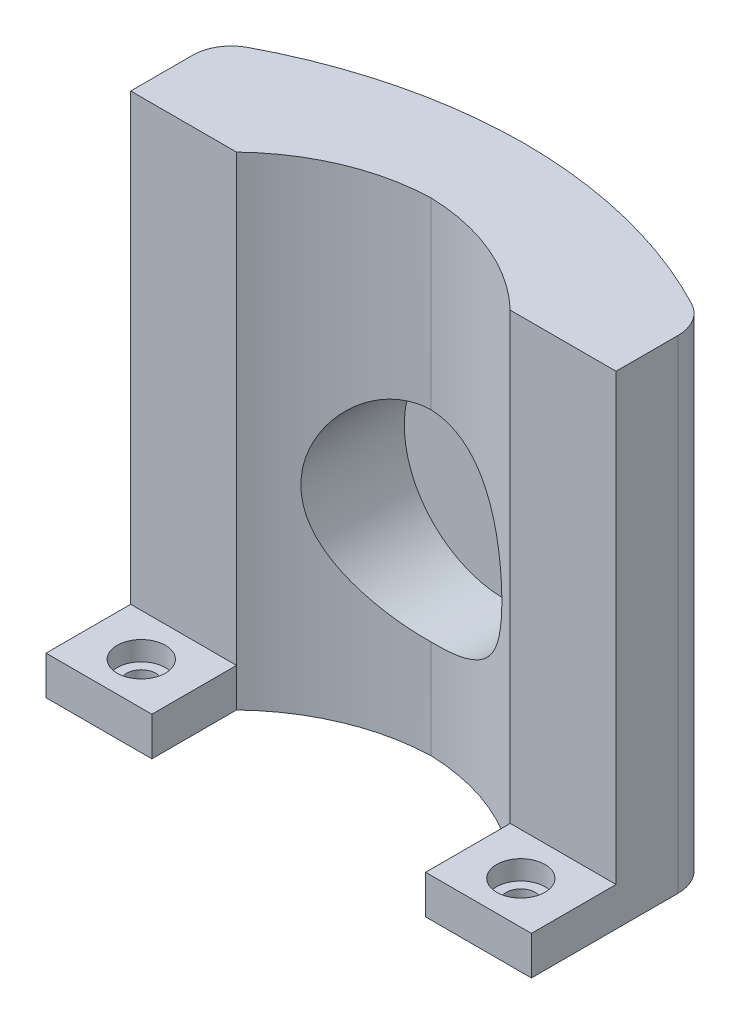
ISO-10303-21;
HEADER;
FILE_DESCRIPTION(('STEP AP214'),'2;1');
FILE_NAME('part.step','',(''),(''),'','','');
FILE_SCHEMA(('AUTOMOTIVE_DESIGN { 1 0 10303 214 1 1 1 1 }'));
ENDSEC;
DATA;
#1=APPLICATION_CONTEXT('core data for automotive mechanical design processes');
#2=APPLICATION_PROTOCOL_DEFINITION('international standard','automotive_design',2000,#1);
#3=PRODUCT_CONTEXT('',#1,'mechanical');
#4=PRODUCT('Part','Part','',(#3));
#5=PRODUCT_RELATED_PRODUCT_CATEGORY('part','',(#4));
#6=PRODUCT_DEFINITION_FORMATION('','',#4);
#7=PRODUCT_DEFINITION_CONTEXT('part definition',#1,'design');
#8=PRODUCT_DEFINITION('design','',#6,#7);
#9=PRODUCT_DEFINITION_SHAPE('','',#8);
#10=(LENGTH_UNIT() NAMED_UNIT(*) SI_UNIT(.MILLI.,.METRE.));
#11=(NAMED_UNIT(*) PLANE_ANGLE_UNIT() SI_UNIT($,.RADIAN.));
#12=(NAMED_UNIT(*) SI_UNIT($,.STERADIAN.) SOLID_ANGLE_UNIT());
#13=UNCERTAINTY_MEASURE_WITH_UNIT(LENGTH_MEASURE(1.E-05),#10,'distance_accuracy_value','');
#14=(GEOMETRIC_REPRESENTATION_CONTEXT(3) GLOBAL_UNCERTAINTY_ASSIGNED_CONTEXT((#13)) GLOBAL_UNIT_ASSIGNED_CONTEXT((#10,
#11,#12)) REPRESENTATION_CONTEXT('',''));
#15=CARTESIAN_POINT('',(0.,0.,0.));
#16=DIRECTION('',(0.,0.,1.));
#17=DIRECTION('',(1.,0.,0.));
#18=AXIS2_PLACEMENT_3D('',#15,#16,#17);
#19=CARTESIAN_POINT('',(-0.180505990510404,63.5,-0.311093454396658));
#20=DIRECTION('',(0.,-1.,0.));
#21=DIRECTION('',(0.,0.,-1.));
#22=AXIS2_PLACEMENT_3D('',#19,#20,#21);
#23=CYLINDRICAL_SURFACE('',#22,62.976967567455);
#24=CARTESIAN_POINT('',(-0.180505990510404,63.5,-0.311093454396658));
#25=DIRECTION('',(0.,1.,0.));
#26=DIRECTION('',(0.,0.,1.));
#27=AXIS2_PLACEMENT_3D('',#24,#25,#26);
#28=CIRCLE('',#27,62.976967567455);
#29=CARTESIAN_POINT('',(0.,63.5,-63.2878023361703));
#30=VERTEX_POINT('',#29);
#31=CARTESIAN_POINT('',(29.1850100160938,63.5,-56.022536746221));
#32=VERTEX_POINT('',#31);
#33=EDGE_CURVE('E255',#30,#32,#28,.F.);
#34=ORIENTED_EDGE('',*,*,#33,.T.);
#35=DIRECTION('',(0.,-1.,0.));
#36=VECTOR('',#35,1.);
#37=CARTESIAN_POINT('',(29.1850100160938,63.5,-56.022536746221));
#38=LINE('',#37,#36);
#39=CARTESIAN_POINT('',(29.1850100160938,0.,-56.022536746221));
#40=VERTEX_POINT('',#39);
#41=EDGE_CURVE('E154',#32,#40,#38,.T.);
#42=ORIENTED_EDGE('',*,*,#41,.T.);
#43=CARTESIAN_POINT('',(-0.180505990510404,0.,-0.311093454396658));
#44=DIRECTION('',(0.,1.,0.));
#45=DIRECTION('',(0.,0.,1.));
#46=AXIS2_PLACEMENT_3D('',#43,#44,#45);
#47=CIRCLE('',#46,62.976967567455);
#48=CARTESIAN_POINT('',(0.,0.,-63.2878023361703));
#49=VERTEX_POINT('',#48);
#50=EDGE_CURVE('E254',#49,#40,#47,.F.);
#51=ORIENTED_EDGE('',*,*,#50,.F.);
#52=DIRECTION('',(0.,-1.,0.));
#53=VECTOR('',#52,1.);
#54=CARTESIAN_POINT('',(0.,63.5,-63.2878023361703));
#55=LINE('',#54,#53);
#56=EDGE_CURVE('E155',#30,#49,#55,.T.);
#57=ORIENTED_EDGE('',*,*,#56,.F.);
#58=EDGE_LOOP('',(#34,#42,#51,#57));
#59=FACE_BOUND('',#58,.T.);
#60=ADVANCED_FACE('F35',(#59),#23,.T.);
#61=CARTESIAN_POINT('',(0.180505990510404,63.5,-0.311093454396602));
#62=DIRECTION('',(0.,-1.,0.));
#63=DIRECTION('',(0.,0.,-1.));
#64=AXIS2_PLACEMENT_3D('',#61,#62,#63);
#65=CYLINDRICAL_SURFACE('',#64,62.9769675674551);
#66=CARTESIAN_POINT('',(0.180505990510404,0.,-0.311093454396602));
#67=DIRECTION('',(0.,1.,0.));
#68=DIRECTION('',(0.,0.,1.));
#69=AXIS2_PLACEMENT_3D('',#66,#67,#68);
#70=CIRCLE('',#69,62.9769675674551);
#71=CARTESIAN_POINT('',(-29.1850100160938,0.,-56.022536746221));
#72=VERTEX_POINT('',#71);
#73=EDGE_CURVE('E258',#49,#72,#70,.T.);
#74=ORIENTED_EDGE('',*,*,#73,.T.);
#75=DIRECTION('',(0.,-1.,0.));
#76=VECTOR('',#75,1.);
#77=CARTESIAN_POINT('',(-29.1850100160938,63.5,-56.022536746221));
#78=LINE('',#77,#76);
#79=CARTESIAN_POINT('',(-29.1850100160938,63.5,-56.022536746221));
#80=VERTEX_POINT('',#79);
#81=EDGE_CURVE('E11',#72,#80,#78,.F.);
#82=ORIENTED_EDGE('',*,*,#81,.T.);
#83=CARTESIAN_POINT('',(0.180505990510404,63.5,-0.311093454396602));
#84=DIRECTION('',(0.,1.,0.));
#85=DIRECTION('',(0.,0.,1.));
#86=AXIS2_PLACEMENT_3D('',#83,#84,#85);
#87=CIRCLE('',#86,62.9769675674551);
#88=EDGE_CURVE('E296',#30,#80,#87,.T.);
#89=ORIENTED_EDGE('',*,*,#88,.F.);
#90=ORIENTED_EDGE('',*,*,#56,.T.);
#91=EDGE_LOOP('',(#74,#82,#89,#90));
#92=FACE_BOUND('',#91,.T.);
#93=ADVANCED_FACE('F218',(#92),#65,.T.);
#94=CARTESIAN_POINT('',(-31.8962579615627,63.5,0.));
#95=DIRECTION('',(1.,0.,0.));
#96=DIRECTION('',(0.,0.,-1.));
#97=AXIS2_PLACEMENT_3D('',#94,#95,#96);
#98=PLANE('',#97);
#99=DIRECTION('',(0.,0.,1.));
#100=VECTOR('',#99,1.);
#101=CARTESIAN_POINT('',(-31.8962579615627,63.5,0.));
#102=LINE('',#101,#100);
#103=CARTESIAN_POINT('',(-31.8962579615627,63.5,-51.5286059830522));
#104=VERTEX_POINT('',#103);
#105=CARTESIAN_POINT('',(-31.8962579615627,63.5,-43.3824232969375));
#106=VERTEX_POINT('',#105);
#107=EDGE_CURVE('E294',#104,#106,#102,.T.);
#108=ORIENTED_EDGE('',*,*,#107,.F.);
#109=DIRECTION('',(0.,-1.,0.));
#110=VECTOR('',#109,1.);
#111=CARTESIAN_POINT('',(-31.8962579615627,63.5,-51.5286059830522));
#112=LINE('',#111,#110);
#113=CARTESIAN_POINT('',(-31.8962579615627,0.,-51.5286059830522));
#114=VERTEX_POINT('',#113);
#115=EDGE_CURVE('E43',#104,#114,#112,.T.);
#116=ORIENTED_EDGE('',*,*,#115,.T.);
#117=DIRECTION('',(0.,0.,1.));
#118=VECTOR('',#117,1.);
#119=CARTESIAN_POINT('',(-31.8962579615627,0.,0.));
#120=LINE('',#119,#118);
#121=CARTESIAN_POINT('',(-31.8962579615627,0.,-32.258));
#122=VERTEX_POINT('',#121);
#123=EDGE_CURVE('E261',#114,#122,#120,.T.);
#124=ORIENTED_EDGE('',*,*,#123,.T.);
#125=DIRECTION('',(0.,-1.,0.));
#126=VECTOR('',#125,1.);
#127=CARTESIAN_POINT('',(-31.8962579615627,5.08,-32.258));
#128=LINE('',#127,#126);
#129=CARTESIAN_POINT('',(-31.8962579615627,5.08,-32.258));
#130=VERTEX_POINT('',#129);
#131=EDGE_CURVE('E264',#130,#122,#128,.T.);
#132=ORIENTED_EDGE('',*,*,#131,.F.);
#133=DIRECTION('',(0.,0.,1.));
#134=VECTOR('',#133,1.);
#135=CARTESIAN_POINT('',(-31.8962579615627,5.08,0.));
#136=LINE('',#135,#134);
#137=CARTESIAN_POINT('',(-31.8962579615627,5.08,-43.3824232969375));
#138=VERTEX_POINT('',#137);
#139=EDGE_CURVE('E312',#138,#130,#136,.T.);
#140=ORIENTED_EDGE('',*,*,#139,.F.);
#141=DIRECTION('',(0.,-1.,0.));
#142=VECTOR('',#141,1.);
#143=CARTESIAN_POINT('',(-31.8962579615627,63.5,-43.3824232969375));
#144=LINE('',#143,#142);
#145=EDGE_CURVE('E174',#106,#138,#144,.T.);
#146=ORIENTED_EDGE('',*,*,#145,.F.);
#147=EDGE_LOOP('',(#108,#116,#124,#132,#140,#146));
#148=FACE_BOUND('',#147,.T.);
#149=ADVANCED_FACE('F214',(#148),#98,.F.);
#150=CARTESIAN_POINT('',(0.,63.5,-43.3824232969375));
#151=DIRECTION('',(0.,0.,1.));
#152=DIRECTION('',(1.,0.,0.));
#153=AXIS2_PLACEMENT_3D('',#150,#151,#152);
#154=PLANE('',#153);
#155=DIRECTION('',(-1.,0.,0.));
#156=VECTOR('',#155,1.);
#157=CARTESIAN_POINT('',(0.,5.08,-43.3824232969375));
#158=LINE('',#157,#156);
#159=CARTESIAN_POINT('',(-17.9866471935735,5.08,-43.3824232969375));
#160=VERTEX_POINT('',#159);
#161=EDGE_CURVE('E314',#160,#138,#158,.T.);
#162=ORIENTED_EDGE('',*,*,#161,.F.);
#163=DIRECTION('',(0.,-1.,0.));
#164=VECTOR('',#163,1.);
#165=CARTESIAN_POINT('',(-17.9866471935735,63.5,-43.3824232969375));
#166=LINE('',#165,#164);
#167=CARTESIAN_POINT('',(-17.9866471935735,63.5,-43.3824232969375));
#168=VERTEX_POINT('',#167);
#169=EDGE_CURVE('E171',#168,#160,#166,.T.);
#170=ORIENTED_EDGE('',*,*,#169,.F.);
#171=DIRECTION('',(-1.,0.,0.));
#172=VECTOR('',#171,1.);
#173=CARTESIAN_POINT('',(0.,63.5,-43.3824232969375));
#174=LINE('',#173,#172);
#175=EDGE_CURVE('E291',#168,#106,#174,.T.);
#176=ORIENTED_EDGE('',*,*,#175,.T.);
#177=ORIENTED_EDGE('',*,*,#145,.T.);
#178=EDGE_LOOP('',(#162,#170,#176,#177));
#179=FACE_BOUND('',#178,.T.);
#180=ADVANCED_FACE('F211',(#179),#154,.T.);
#181=CARTESIAN_POINT('',(0.801152135303896,63.5,-23.9042364936411));
#182=DIRECTION('',(0.,-1.,0.));
#183=DIRECTION('',(0.,0.,-1.));
#184=AXIS2_PLACEMENT_3D('',#181,#182,#183);
#185=CYLINDRICAL_SURFACE('',#184,27.0625417277512);
#186=DIRECTION('',(0.,-1.,0.));
#187=VECTOR('',#186,1.);
#188=CARTESIAN_POINT('',(0.,63.5,-50.95491707699));
#189=LINE('',#188,#187);
#190=CARTESIAN_POINT('',(0.,12.9675005366868,-50.95491707699));
#191=VERTEX_POINT('',#190);
#192=CARTESIAN_POINT('',(0.,0.,-50.95491707699));
#193=VERTEX_POINT('',#192);
#194=EDGE_CURVE('E164',#191,#193,#189,.T.);
#195=ORIENTED_EDGE('',*,*,#194,.F.);
#196=CARTESIAN_POINT('',(0.,12.9675005366868,-50.95491707699));
#197=CARTESIAN_POINT('',(-0.17623660816827,12.9674996066172,-50.9496996508642));
#198=CARTESIAN_POINT('',(-0.352397840058091,12.9710285741083,-50.9427558555194));
#199=CARTESIAN_POINT('',(-0.704262090348875,12.9851145570214,-50.9254486187416));
#200=CARTESIAN_POINT('',(-0.879965131258562,12.9956712204188,-50.9150853486067));
#201=CARTESIAN_POINT('',(-1.4057185649317,13.037816933152,-50.8789309879349));
#202=CARTESIAN_POINT('',(-1.75464901114199,13.0798817941758,-50.8480683012942));
#203=CARTESIAN_POINT('',(-2.44505398551162,13.1910971785665,-50.773612846842));
#204=CARTESIAN_POINT('',(-2.78655542439957,13.2601222380213,-50.7300792808764));
#205=CARTESIAN_POINT('',(-3.4614536549236,13.4244135830949,-50.6311456373399));
#206=CARTESIAN_POINT('',(-3.79484983020004,13.5196818576117,-50.5757446604426));
#207=CARTESIAN_POINT('',(-4.45086853820878,13.7352401434498,-50.4543509002295));
#208=CARTESIAN_POINT('',(-4.77350656335245,13.8554921951821,-50.3883742196638));
#209=CARTESIAN_POINT('',(-5.40672212509092,14.119947349198,-50.2471427521074));
#210=CARTESIAN_POINT('',(-5.7172986057615,14.2641525426466,-50.1718871551938));
#211=CARTESIAN_POINT('',(-6.32505602797939,14.5754310704993,-50.0135649598854));
#212=CARTESIAN_POINT('',(-6.62222435620634,14.7425253645053,-49.9304912244804));
#213=CARTESIAN_POINT('',(-7.20150586505261,15.0982660525547,-49.7582489067013));
#214=CARTESIAN_POINT('',(-7.4836184075775,15.2869133589955,-49.6690800663691));
#215=CARTESIAN_POINT('',(-8.04922495558243,15.6973774679276,-49.4805237879221));
#216=CARTESIAN_POINT('',(-8.33164154500689,15.920547070987,-49.3808479563779));
#217=CARTESIAN_POINT('',(-8.87687456532083,16.3886968613163,-49.1787599510287));
#218=CARTESIAN_POINT('',(-9.13968474101214,16.6336839549797,-49.0763469179858));
#219=CARTESIAN_POINT('',(-9.64453913733876,17.1442724214726,-48.8710742943601));
#220=CARTESIAN_POINT('',(-9.88657348873206,17.4098834785489,-48.7682145156655));
#221=CARTESIAN_POINT('',(-10.348566062054,17.9604172746863,-48.56450209453));
#222=CARTESIAN_POINT('',(-10.5685223805307,18.2453416753007,-48.4636496257488));
#223=CARTESIAN_POINT('',(-11.0002910203846,18.8546912010231,-48.2592818263943));
#224=CARTESIAN_POINT('',(-11.2103434276068,19.1804818607415,-48.1561075298713));
#225=CARTESIAN_POINT('',(-11.6018767961904,19.8510723586067,-47.9582207212985));
#226=CARTESIAN_POINT('',(-11.7833698489356,20.1958640682037,-47.8635046356196));
#227=CARTESIAN_POINT('',(-12.1160625734458,20.9024846079956,-47.6857903470014));
#228=CARTESIAN_POINT('',(-12.2672771236762,21.2643049620475,-47.6027863948219));
#229=CARTESIAN_POINT('',(-12.5376924552035,22.0027245015569,-47.4516445878788));
#230=CARTESIAN_POINT('',(-12.656897552346,22.3793216867936,-47.383504729217));
#231=CARTESIAN_POINT('',(-12.8539877864536,23.1159778101785,-47.2693882409102));
#232=CARTESIAN_POINT('',(-12.9342792225355,23.4751960306761,-47.2221439575565));
#233=CARTESIAN_POINT('',(-13.0647642065492,24.2008936235251,-47.1447897457235));
#234=CARTESIAN_POINT('',(-13.1149593810353,24.5673726023623,-47.1146788912715));
#235=CARTESIAN_POINT('',(-13.1844030929417,25.3039935068884,-47.0729020210251));
#236=CARTESIAN_POINT('',(-13.2036775963226,25.6741320962545,-47.0612205291153));
#237=CARTESIAN_POINT('',(-13.2110225543718,26.4148156319579,-47.0567776385213));
#238=CARTESIAN_POINT('',(-13.1990960211146,26.7853605356186,-47.0640144135121));
#239=CARTESIAN_POINT('',(-13.1477446946202,27.476458143655,-47.0949708516313));
#240=CARTESIAN_POINT('',(-13.1119983208076,27.7973923184508,-47.1164842005188));
#241=CARTESIAN_POINT('',(-13.0173474283438,28.4346326818228,-47.1729552817931));
#242=CARTESIAN_POINT('',(-12.9584424461367,28.7509387776293,-47.2079132832955));
#243=CARTESIAN_POINT('',(-12.8181533428685,29.3769269765477,-47.2901783636409));
#244=CARTESIAN_POINT('',(-12.7367650781937,29.6866078473007,-47.3374877187197));
#245=CARTESIAN_POINT('',(-12.5523641018734,30.297544692904,-47.4430563963755));
#246=CARTESIAN_POINT('',(-12.4493501344668,30.5988001773573,-47.5013163548116));
#247=CARTESIAN_POINT('',(-12.2192849047431,31.2001419142261,-47.6290587583816));
#248=CARTESIAN_POINT('',(-12.091613527769,31.4999308075062,-47.6988218532496));
#249=CARTESIAN_POINT('',(-11.8153406134264,32.0877334587995,-47.8464544868348));
#250=CARTESIAN_POINT('',(-11.6667320656433,32.3757432309497,-47.9243267384618));
#251=CARTESIAN_POINT('',(-11.3495969702292,32.9388088113104,-48.0862992420591));
#252=CARTESIAN_POINT('',(-11.1810667159028,33.2138621954581,-48.1704006519557));
#253=CARTESIAN_POINT('',(-10.8250590859929,33.749992233571,-48.3429662226841));
#254=CARTESIAN_POINT('',(-10.6375800874285,34.0110676873764,-48.4314307568893));
#255=CARTESIAN_POINT('',(-10.2176857714709,34.5530412093359,-48.6231900059737));
#256=CARTESIAN_POINT('',(-9.98263143534797,34.8317672729182,-48.7268583226811));
#257=CARTESIAN_POINT('',(-9.49054973576784,35.368611130906,-48.9348850936125));
#258=CARTESIAN_POINT('',(-9.23352974728936,35.6267357863919,-49.0392433054307));
#259=CARTESIAN_POINT('',(-8.69839701279775,36.1214573205022,-49.2463381287811));
#260=CARTESIAN_POINT('',(-8.42026300123308,36.3580319525733,-49.3490729760707));
#261=CARTESIAN_POINT('',(-7.8445402106077,36.8078972374368,-49.5504083129813));
#262=CARTESIAN_POINT('',(-7.54695906007643,37.0211969336664,-49.6490103991421));
#263=CARTESIAN_POINT('',(-6.91644978864414,37.4344480123149,-49.8452231182057));
#264=CARTESIAN_POINT('',(-6.58247534677855,37.6329810258607,-49.9424683815206));
#265=CARTESIAN_POINT('',(-5.89618139245858,38.0008072943479,-50.1273784501167));
#266=CARTESIAN_POINT('',(-5.54385962622493,38.1700969459652,-50.2150420742743));
#267=CARTESIAN_POINT('',(-4.82380965368774,38.4773337022214,-50.3783188318992));
#268=CARTESIAN_POINT('',(-4.45610743967427,38.6153313407212,-50.4539513347461));
#269=CARTESIAN_POINT('',(-3.70756715479577,38.858557170456,-50.5912600574621));
#270=CARTESIAN_POINT('',(-3.32673435165422,38.9637983368494,-50.65294180071));
#271=CARTESIAN_POINT('',(-2.70133599124051,39.1066467665544,-50.7402646744116));
#272=CARTESIAN_POINT('',(-2.45978558452046,39.1547737332891,-50.7707081737067));
#273=CARTESIAN_POINT('',(-1.97371956696264,39.2375231620579,-50.825250939103));
#274=CARTESIAN_POINT('',(-1.72920479151561,39.2721493415533,-50.8493519510224));
#275=CARTESIAN_POINT('',(-1.23789081898948,39.327687889646,-50.8909784467873));
#276=CARTESIAN_POINT('',(-0.99109011779318,39.3485904653357,-50.9084992312982));
#277=CARTESIAN_POINT('',(-0.496230559682525,39.3765064841677,-50.9368026499668));
#278=CARTESIAN_POINT('',(-0.248171278251052,39.3835148785829,-50.9475828338194));
#279=CARTESIAN_POINT('',(0.,39.3835005366868,-50.95491707699));
#280=B_SPLINE_CURVE_WITH_KNOTS('',3,(#196,#197,#198,#199,#200,#201,#202,#203,#204,#205,#206,
#207,#208,#209,#210,#211,#212,#213,#214,#215,#216,#217,#218,#219,#220,#221,#222,#223,#224,#225,
#226,#227,#228,#229,#230,#231,#232,#233,#234,#235,#236,#237,#238,#239,#240,#241,#242,#243,#244,
#245,#246,#247,#248,#249,#250,#251,#252,#253,#254,#255,#256,#257,#258,#259,#260,#261,#262,#263,
#264,#265,#266,#267,#268,#269,#270,#271,#272,#273,#274,#275,#276,#277,#278,#279),.UNSPECIFIED.,
.F.,.F.,(4,2,2,2,2,2,2,2,2,2,2,2,2,2,2,2,2,2,2,2,2,2,2,2,2,2,2,2,2,2,2,2,2,2,2,2,2,2,2,2,2,4),
(0.,0.528849907679136,1.05767332670689,2.11461513707331,3.16669579330153,4.21885620565712,
5.26942953758182,6.32009463525046,7.37172834212723,8.42340658401401,9.54270329585068,
10.6623555925536,11.7825368532643,12.9028146073153,14.1046847713652,15.3060447137429,
16.5068128667704,17.7074190384275,18.8191098924713,19.9307406596996,21.0414374336519,
22.1520269875152,23.1217980650731,24.0915885551083,25.0615578945278,26.0315835737117,
27.0302607934758,28.0292731996001,29.0284717785712,30.0277560126444,31.1637018433308,
32.2992677668254,33.4359929802445,34.5722749363619,35.7722483330356,36.9723694833608,
38.170538517201,39.3682323388039,40.1123365374168,40.8562357009139,41.6006651216759,
42.3453649961292),.UNSPECIFIED.);
#281=CARTESIAN_POINT('',(0.,39.3835005366868,-50.95491707699));
#282=VERTEX_POINT('',#281);
#283=EDGE_CURVE('E150',#191,#282,#280,.T.);
#284=ORIENTED_EDGE('',*,*,#283,.T.);
#285=CARTESIAN_POINT('',(0.,63.5,-50.95491707699));
#286=VERTEX_POINT('',#285);
#287=EDGE_CURVE('E161',#286,#282,#189,.T.);
#288=ORIENTED_EDGE('',*,*,#287,.F.);
#289=CARTESIAN_POINT('',(0.801152135303896,63.5,-23.9042364936411));
#290=DIRECTION('',(0.,1.,0.));
#291=DIRECTION('',(0.,0.,1.));
#292=AXIS2_PLACEMENT_3D('',#289,#290,#291);
#293=CIRCLE('',#292,27.0625417277512);
#294=EDGE_CURVE('E287',#168,#286,#293,.F.);
#295=ORIENTED_EDGE('',*,*,#294,.F.);
#296=ORIENTED_EDGE('',*,*,#169,.T.);
#297=DIRECTION('',(0.,-1.,0.));
#298=VECTOR('',#297,1.);
#299=CARTESIAN_POINT('',(-17.9866471935735,5.08,-43.3824232969375));
#300=LINE('',#299,#298);
#301=CARTESIAN_POINT('',(-17.9866471935735,0.,-43.3824232969375));
#302=VERTEX_POINT('',#301);
#303=EDGE_CURVE('E259',#160,#302,#300,.T.);
#304=ORIENTED_EDGE('',*,*,#303,.T.);
#305=CARTESIAN_POINT('',(0.801152135303896,0.,-23.9042364936411));
#306=DIRECTION('',(0.,1.,0.));
#307=DIRECTION('',(0.,0.,1.));
#308=AXIS2_PLACEMENT_3D('',#305,#306,#307);
#309=CIRCLE('',#308,27.0625417277512);
#310=EDGE_CURVE('E271',#302,#193,#309,.F.);
#311=ORIENTED_EDGE('',*,*,#310,.T.);
#312=EDGE_LOOP('',(#195,#284,#288,#295,#296,#304,#311));
#313=FACE_BOUND('',#312,.T.);
#314=ADVANCED_FACE('F159',(#313),#185,.F.);
#315=CARTESIAN_POINT('',(-0.801152135303896,63.5,-23.9042364936411));
#316=DIRECTION('',(0.,-1.,0.));
#317=DIRECTION('',(0.,0.,-1.));
#318=AXIS2_PLACEMENT_3D('',#315,#316,#317);
#319=CYLINDRICAL_SURFACE('',#318,27.0625417277512);
#320=CARTESIAN_POINT('',(0.,12.9675005366868,-50.95491707699));
#321=CARTESIAN_POINT('',(0.176236608168248,12.9674996066172,-50.9496996508642));
#322=CARTESIAN_POINT('',(0.352397840058068,12.9710285741083,-50.9427558555194));
#323=CARTESIAN_POINT('',(0.704262090348852,12.9851145570214,-50.9254486187416));
#324=CARTESIAN_POINT('',(0.879965131258539,12.9956712204188,-50.9150853486067));
#325=CARTESIAN_POINT('',(1.40571856493168,13.037816933152,-50.8789309879349));
#326=CARTESIAN_POINT('',(1.75464901114196,13.0798817941758,-50.8480683012942));
#327=CARTESIAN_POINT('',(2.4450539855116,13.1910971785665,-50.773612846842));
#328=CARTESIAN_POINT('',(2.78655542439955,13.2601222380213,-50.7300792808764));
#329=CARTESIAN_POINT('',(3.46145365492358,13.4244135830949,-50.6311456373399));
#330=CARTESIAN_POINT('',(3.79484983020002,13.5196818576117,-50.5757446604426));
#331=CARTESIAN_POINT('',(4.45086853820876,13.7352401434498,-50.4543509002296));
#332=CARTESIAN_POINT('',(4.77350656335243,13.8554921951821,-50.3883742196638));
#333=CARTESIAN_POINT('',(5.4067221250909,14.119947349198,-50.2471427521075));
#334=CARTESIAN_POINT('',(5.71729860576148,14.2641525426466,-50.1718871551938));
#335=CARTESIAN_POINT('',(6.32505602797937,14.5754310704993,-50.0135649598855));
#336=CARTESIAN_POINT('',(6.62222435620632,14.7425253645053,-49.9304912244804));
#337=CARTESIAN_POINT('',(7.20150586505259,15.0982660525547,-49.7582489067013));
#338=CARTESIAN_POINT('',(7.48361840757748,15.2869133589955,-49.6690800663691));
#339=CARTESIAN_POINT('',(8.04922495558242,15.6973774679276,-49.4805237879221));
#340=CARTESIAN_POINT('',(8.33164154500688,15.920547070987,-49.3808479563779));
#341=CARTESIAN_POINT('',(8.87687456532082,16.3886968613163,-49.1787599510287));
#342=CARTESIAN_POINT('',(9.13968474101212,16.6336839549797,-49.0763469179859));
#343=CARTESIAN_POINT('',(9.64453913733875,17.1442724214726,-48.8710742943601));
#344=CARTESIAN_POINT('',(9.88657348873205,17.4098834785489,-48.7682145156655));
#345=CARTESIAN_POINT('',(10.348566062054,17.9604172746863,-48.5645020945301));
#346=CARTESIAN_POINT('',(10.5685223805307,18.2453416753007,-48.4636496257488));
#347=CARTESIAN_POINT('',(11.0002910203846,18.854691201023,-48.2592818263943));
#348=CARTESIAN_POINT('',(11.2103434276068,19.1804818607415,-48.1561075298713));
#349=CARTESIAN_POINT('',(11.6018767961904,19.8510723586067,-47.9582207212985));
#350=CARTESIAN_POINT('',(11.7833698489356,20.1958640682037,-47.8635046356196));
#351=CARTESIAN_POINT('',(12.1160625734458,20.9024846079956,-47.6857903470015));
#352=CARTESIAN_POINT('',(12.2672771236762,21.2643049620475,-47.6027863948219));
#353=CARTESIAN_POINT('',(12.5376924552035,22.0027245015569,-47.4516445878788));
#354=CARTESIAN_POINT('',(12.656897552346,22.3793216867936,-47.383504729217));
#355=CARTESIAN_POINT('',(12.8539877864536,23.1159778101784,-47.2693882409102));
#356=CARTESIAN_POINT('',(12.9342792225355,23.4751960306761,-47.2221439575565));
#357=CARTESIAN_POINT('',(13.0647642065492,24.2008936235251,-47.1447897457235));
#358=CARTESIAN_POINT('',(13.1149593810353,24.5673726023622,-47.1146788912715));
#359=CARTESIAN_POINT('',(13.1844030929417,25.3039935068884,-47.0729020210251));
#360=CARTESIAN_POINT('',(13.2036775963226,25.6741320962545,-47.0612205291153));
#361=CARTESIAN_POINT('',(13.2110225543718,26.4148156319579,-47.0567776385213));
#362=CARTESIAN_POINT('',(13.1990960211146,26.7853605356186,-47.0640144135121));
#363=CARTESIAN_POINT('',(13.1477446946202,27.476458143655,-47.0949708516313));
#364=CARTESIAN_POINT('',(13.1119983208076,27.7973923184507,-47.1164842005188));
#365=CARTESIAN_POINT('',(13.0173474283438,28.4346326818228,-47.1729552817931));
#366=CARTESIAN_POINT('',(12.9584424461367,28.7509387776293,-47.2079132832955));
#367=CARTESIAN_POINT('',(12.8181533428685,29.3769269765477,-47.2901783636409));
#368=CARTESIAN_POINT('',(12.7367650781937,29.6866078473007,-47.3374877187197));
#369=CARTESIAN_POINT('',(12.5523641018735,30.297544692904,-47.4430563963755));
#370=CARTESIAN_POINT('',(12.4493501344668,30.5988001773573,-47.5013163548116));
#371=CARTESIAN_POINT('',(12.2192849047431,31.2001419142261,-47.6290587583816));
#372=CARTESIAN_POINT('',(12.091613527769,31.4999308075062,-47.6988218532496));
#373=CARTESIAN_POINT('',(11.8153406134264,32.0877334587994,-47.8464544868348));
#374=CARTESIAN_POINT('',(11.6667320656433,32.3757432309497,-47.9243267384618));
#375=CARTESIAN_POINT('',(11.3495969702292,32.9388088113103,-48.0862992420591));
#376=CARTESIAN_POINT('',(11.1810667159028,33.2138621954581,-48.1704006519557));
#377=CARTESIAN_POINT('',(10.8250590859929,33.7499922335709,-48.3429662226841));
#378=CARTESIAN_POINT('',(10.6375800874286,34.0110676873763,-48.4314307568893));
#379=CARTESIAN_POINT('',(10.2176857714709,34.5530412093359,-48.6231900059737));
#380=CARTESIAN_POINT('',(9.98263143534798,34.8317672729182,-48.7268583226811));
#381=CARTESIAN_POINT('',(9.49054973576786,35.368611130906,-48.9348850936126));
#382=CARTESIAN_POINT('',(9.23352974728938,35.6267357863919,-49.0392433054307));
#383=CARTESIAN_POINT('',(8.69839701279778,36.1214573205021,-49.2463381287811));
#384=CARTESIAN_POINT('',(8.42026300123311,36.3580319525733,-49.3490729760708));
#385=CARTESIAN_POINT('',(7.84454021060772,36.8078972374368,-49.5504083129814));
#386=CARTESIAN_POINT('',(7.54695906007645,37.0211969336664,-49.6490103991421));
#387=CARTESIAN_POINT('',(6.91644978864417,37.4344480123149,-49.8452231182057));
#388=CARTESIAN_POINT('',(6.58247534677857,37.6329810258607,-49.9424683815206));
#389=CARTESIAN_POINT('',(5.8961813924586,38.0008072943479,-50.1273784501167));
#390=CARTESIAN_POINT('',(5.54385962622496,38.1700969459652,-50.2150420742743));
#391=CARTESIAN_POINT('',(4.82380965368777,38.4773337022214,-50.3783188318992));
#392=CARTESIAN_POINT('',(4.4561074396743,38.6153313407212,-50.4539513347461));
#393=CARTESIAN_POINT('',(3.7075671547958,38.858557170456,-50.5912600574621));
#394=CARTESIAN_POINT('',(3.32673435165425,38.9637983368494,-50.65294180071));
#395=CARTESIAN_POINT('',(2.70133599124053,39.1066467665544,-50.7402646744116));
#396=CARTESIAN_POINT('',(2.45978558452048,39.1547737332891,-50.7707081737067));
#397=CARTESIAN_POINT('',(1.97371956696265,39.2375231620579,-50.825250939103));
#398=CARTESIAN_POINT('',(1.72920479151561,39.2721493415533,-50.8493519510224));
#399=CARTESIAN_POINT('',(1.23789081898947,39.327687889646,-50.8909784467873));
#400=CARTESIAN_POINT('',(0.991090117793174,39.3485904653357,-50.9084992312982));
#401=CARTESIAN_POINT('',(0.496230559682511,39.3765064841677,-50.9368026499668));
#402=CARTESIAN_POINT('',(0.248171278251034,39.3835148785829,-50.9475828338194));
#403=CARTESIAN_POINT('',(0.,39.3835005366868,-50.95491707699));
#404=B_SPLINE_CURVE_WITH_KNOTS('',3,(#320,#321,#322,#323,#324,#325,#326,#327,#328,#329,#330,
#331,#332,#333,#334,#335,#336,#337,#338,#339,#340,#341,#342,#343,#344,#345,#346,#347,#348,#349,
#350,#351,#352,#353,#354,#355,#356,#357,#358,#359,#360,#361,#362,#363,#364,#365,#366,#367,#368,
#369,#370,#371,#372,#373,#374,#375,#376,#377,#378,#379,#380,#381,#382,#383,#384,#385,#386,#387,
#388,#389,#390,#391,#392,#393,#394,#395,#396,#397,#398,#399,#400,#401,#402,#403),.UNSPECIFIED.,
.F.,.F.,(4,2,2,2,2,2,2,2,2,2,2,2,2,2,2,2,2,2,2,2,2,2,2,2,2,2,2,2,2,2,2,2,2,2,2,2,2,2,2,2,2,4),
(0.,0.528849907679136,1.05767332670689,2.11461513707331,3.16669579330153,4.21885620565712,
5.26942953758183,6.32009463525046,7.37172834212724,8.42340658401402,9.54270329585068,
10.6623555925536,11.7825368532643,12.9028146073153,14.1046847713652,15.3060447137429,
16.5068128667704,17.7074190384275,18.8191098924713,19.9307406596996,21.0414374336519,
22.1520269875152,23.1217980650731,24.0915885551083,25.0615578945278,26.0315835737117,
27.0302607934758,28.0292731996001,29.0284717785712,30.0277560126444,31.1637018433308,
32.2992677668254,33.4359929802445,34.5722749363619,35.7722483330356,36.9723694833608,
38.170538517201,39.3682323388039,40.1123365374168,40.8562357009139,41.6006651216759,
42.3453649961292),.UNSPECIFIED.);
#405=EDGE_CURVE('E147',#191,#282,#404,.T.);
#406=ORIENTED_EDGE('',*,*,#405,.F.);
#407=ORIENTED_EDGE('',*,*,#194,.T.);
#408=CARTESIAN_POINT('',(-0.801152135303896,0.,-23.9042364936411));
#409=DIRECTION('',(0.,1.,0.));
#410=DIRECTION('',(0.,0.,1.));
#411=AXIS2_PLACEMENT_3D('',#408,#409,#410);
#412=CIRCLE('',#411,27.0625417277512);
#413=CARTESIAN_POINT('',(17.9866471935735,0.,-43.3824232969375));
#414=VERTEX_POINT('',#413);
#415=EDGE_CURVE('E273',#414,#193,#412,.T.);
#416=ORIENTED_EDGE('',*,*,#415,.F.);
#417=DIRECTION('',(0.,-1.,0.));
#418=VECTOR('',#417,1.);
#419=CARTESIAN_POINT('',(17.9866471935735,5.08,-43.3824232969375));
#420=LINE('',#419,#418);
#421=CARTESIAN_POINT('',(17.9866471935735,5.08,-43.3824232969375));
#422=VERTEX_POINT('',#421);
#423=EDGE_CURVE('E310',#422,#414,#420,.T.);
#424=ORIENTED_EDGE('',*,*,#423,.F.);
#425=DIRECTION('',(0.,-1.,0.));
#426=VECTOR('',#425,1.);
#427=CARTESIAN_POINT('',(17.9866471935735,63.5,-43.3824232969375));
#428=LINE('',#427,#426);
#429=CARTESIAN_POINT('',(17.9866471935735,63.5,-43.3824232969375));
#430=VERTEX_POINT('',#429);
#431=EDGE_CURVE('E176',#430,#422,#428,.T.);
#432=ORIENTED_EDGE('',*,*,#431,.F.);
#433=CARTESIAN_POINT('',(-0.801152135303896,63.5,-23.9042364936411));
#434=DIRECTION('',(0.,1.,0.));
#435=DIRECTION('',(0.,0.,1.));
#436=AXIS2_PLACEMENT_3D('',#433,#434,#435);
#437=CIRCLE('',#436,27.0625417277512);
#438=EDGE_CURVE('E170',#430,#286,#437,.T.);
#439=ORIENTED_EDGE('',*,*,#438,.T.);
#440=ORIENTED_EDGE('',*,*,#287,.T.);
#441=EDGE_LOOP('',(#406,#407,#416,#424,#432,#439,#440));
#442=FACE_BOUND('',#441,.T.);
#443=ADVANCED_FACE('F168',(#442),#319,.F.);
#444=CARTESIAN_POINT('',(0.,63.5,-43.3824232969375));
#445=DIRECTION('',(0.,0.,-1.));
#446=DIRECTION('',(-1.,0.,0.));
#447=AXIS2_PLACEMENT_3D('',#444,#445,#446);
#448=PLANE('',#447);
#449=ORIENTED_EDGE('',*,*,#431,.T.);
#450=DIRECTION('',(1.,0.,0.));
#451=VECTOR('',#450,1.);
#452=CARTESIAN_POINT('',(0.,5.08,-43.3824232969375));
#453=LINE('',#452,#451);
#454=CARTESIAN_POINT('',(31.8962579615627,5.08,-43.3824232969375));
#455=VERTEX_POINT('',#454);
#456=EDGE_CURVE('E328',#422,#455,#453,.T.);
#457=ORIENTED_EDGE('',*,*,#456,.T.);
#458=DIRECTION('',(0.,-1.,0.));
#459=VECTOR('',#458,1.);
#460=CARTESIAN_POINT('',(31.8962579615627,63.5,-43.3824232969375));
#461=LINE('',#460,#459);
#462=CARTESIAN_POINT('',(31.8962579615627,63.5,-43.3824232969375));
#463=VERTEX_POINT('',#462);
#464=EDGE_CURVE('E277',#463,#455,#461,.T.);
#465=ORIENTED_EDGE('',*,*,#464,.F.);
#466=DIRECTION('',(1.,0.,0.));
#467=VECTOR('',#466,1.);
#468=CARTESIAN_POINT('',(0.,63.5,-43.3824232969375));
#469=LINE('',#468,#467);
#470=EDGE_CURVE('E284',#430,#463,#469,.T.);
#471=ORIENTED_EDGE('',*,*,#470,.F.);
#472=EDGE_LOOP('',(#449,#457,#465,#471));
#473=FACE_BOUND('',#472,.T.);
#474=ADVANCED_FACE('F423',(#473),#448,.F.);
#475=CARTESIAN_POINT('',(31.8962579615627,63.5,0.));
#476=DIRECTION('',(1.,0.,0.));
#477=DIRECTION('',(0.,0.,-1.));
#478=AXIS2_PLACEMENT_3D('',#475,#476,#477);
#479=PLANE('',#478);
#480=DIRECTION('',(0.,0.,1.));
#481=VECTOR('',#480,1.);
#482=CARTESIAN_POINT('',(31.8962579615627,0.,0.));
#483=LINE('',#482,#481);
#484=CARTESIAN_POINT('',(31.8962579615627,0.,-51.5286059830522));
#485=VERTEX_POINT('',#484);
#486=CARTESIAN_POINT('',(31.8962579615627,0.,-32.258));
#487=VERTEX_POINT('',#486);
#488=EDGE_CURVE('E276',#485,#487,#483,.T.);
#489=ORIENTED_EDGE('',*,*,#488,.F.);
#490=DIRECTION('',(0.,-1.,0.));
#491=VECTOR('',#490,1.);
#492=CARTESIAN_POINT('',(31.8962579615627,63.5,-51.5286059830522));
#493=LINE('',#492,#491);
#494=CARTESIAN_POINT('',(31.8962579615627,63.5,-51.5286059830522));
#495=VERTEX_POINT('',#494);
#496=EDGE_CURVE('E237',#485,#495,#493,.F.);
#497=ORIENTED_EDGE('',*,*,#496,.T.);
#498=DIRECTION('',(0.,0.,1.));
#499=VECTOR('',#498,1.);
#500=CARTESIAN_POINT('',(31.8962579615627,63.5,0.));
#501=LINE('',#500,#499);
#502=EDGE_CURVE('E267',#495,#463,#501,.T.);
#503=ORIENTED_EDGE('',*,*,#502,.T.);
#504=ORIENTED_EDGE('',*,*,#464,.T.);
#505=DIRECTION('',(0.,0.,1.));
#506=VECTOR('',#505,1.);
#507=CARTESIAN_POINT('',(31.8962579615627,5.08,0.));
#508=LINE('',#507,#506);
#509=CARTESIAN_POINT('',(31.8962579615627,5.08,-32.258));
#510=VERTEX_POINT('',#509);
#511=EDGE_CURVE('E324',#455,#510,#508,.T.);
#512=ORIENTED_EDGE('',*,*,#511,.T.);
#513=DIRECTION('',(0.,-1.,0.));
#514=VECTOR('',#513,1.);
#515=CARTESIAN_POINT('',(31.8962579615627,5.08,-32.258));
#516=LINE('',#515,#514);
#517=EDGE_CURVE('E321',#510,#487,#516,.T.);
#518=ORIENTED_EDGE('',*,*,#517,.T.);
#519=EDGE_LOOP('',(#489,#497,#503,#504,#512,#518));
#520=FACE_BOUND('',#519,.T.);
#521=ADVANCED_FACE('F419',(#520),#479,.T.);
#522=CARTESIAN_POINT('',(0.,63.5,0.));
#523=DIRECTION('',(0.,1.,0.));
#524=DIRECTION('',(0.,0.,1.));
#525=AXIS2_PLACEMENT_3D('',#522,#523,#524);
#526=PLANE('',#525);
#527=ORIENTED_EDGE('',*,*,#502,.F.);
#528=CARTESIAN_POINT('',(26.8162579615627,63.5,-51.5286059830522));
#529=DIRECTION('',(0.,1.,0.));
#530=DIRECTION('',(0.,0.,1.));
#531=AXIS2_PLACEMENT_3D('',#528,#529,#530);
#532=CIRCLE('',#531,5.08);
#533=EDGE_CURVE('E236',#495,#32,#532,.T.);
#534=ORIENTED_EDGE('',*,*,#533,.T.);
#535=ORIENTED_EDGE('',*,*,#33,.F.);
#536=ORIENTED_EDGE('',*,*,#88,.T.);
#537=CARTESIAN_POINT('',(-26.8162579615627,63.5,-51.5286059830522));
#538=DIRECTION('',(0.,1.,0.));
#539=DIRECTION('',(0.,0.,1.));
#540=AXIS2_PLACEMENT_3D('',#537,#538,#539);
#541=CIRCLE('',#540,5.08);
#542=EDGE_CURVE('E50',#80,#104,#541,.T.);
#543=ORIENTED_EDGE('',*,*,#542,.T.);
#544=ORIENTED_EDGE('',*,*,#107,.T.);
#545=ORIENTED_EDGE('',*,*,#175,.F.);
#546=ORIENTED_EDGE('',*,*,#294,.T.);
#547=ORIENTED_EDGE('',*,*,#438,.F.);
#548=ORIENTED_EDGE('',*,*,#470,.T.);
#549=EDGE_LOOP('',(#527,#534,#535,#536,#543,#544,#545,#546,#547,#548));
#550=FACE_BOUND('',#549,.T.);
#551=ADVANCED_FACE('F416',(#550),#526,.T.);
#552=CARTESIAN_POINT('',(0.,0.,0.));
#553=DIRECTION('',(0.,1.,0.));
#554=DIRECTION('',(0.,0.,1.));
#555=AXIS2_PLACEMENT_3D('',#552,#553,#554);
#556=PLANE('',#555);
#557=CARTESIAN_POINT('',(-24.9414525775681,0.,-37.8202116484687));
#558=DIRECTION('',(0.,1.,0.));
#559=DIRECTION('',(0.,0.,1.));
#560=AXIS2_PLACEMENT_3D('',#557,#558,#559);
#561=CIRCLE('',#560,1.905);
#562=CARTESIAN_POINT('',(-24.9414525775681,0.,-35.9152116484687));
#563=VERTEX_POINT('',#562);
#564=EDGE_CURVE('E206',#563,#563,#561,.T.);
#565=ORIENTED_EDGE('',*,*,#564,.T.);
#566=EDGE_LOOP('',(#565));
#567=FACE_BOUND('',#566,.T.);
#568=CARTESIAN_POINT('',(24.9414525775681,0.,-37.8202116484687));
#569=DIRECTION('',(0.,1.,0.));
#570=DIRECTION('',(0.,0.,-1.));
#571=AXIS2_PLACEMENT_3D('',#568,#569,#570);
#572=CIRCLE('',#571,1.905);
#573=CARTESIAN_POINT('',(24.9414525775681,0.,-39.7252116484687));
#574=VERTEX_POINT('',#573);
#575=EDGE_CURVE('E354',#574,#574,#572,.T.);
#576=ORIENTED_EDGE('',*,*,#575,.T.);
#577=EDGE_LOOP('',(#576));
#578=FACE_BOUND('',#577,.T.);
#579=ORIENTED_EDGE('',*,*,#50,.T.);
#580=CARTESIAN_POINT('',(26.8162579615627,0.,-51.5286059830522));
#581=DIRECTION('',(0.,1.,0.));
#582=DIRECTION('',(0.,0.,1.));
#583=AXIS2_PLACEMENT_3D('',#580,#581,#582);
#584=CIRCLE('',#583,5.08);
#585=EDGE_CURVE('E247',#40,#485,#584,.F.);
#586=ORIENTED_EDGE('',*,*,#585,.T.);
#587=ORIENTED_EDGE('',*,*,#488,.T.);
#588=DIRECTION('',(-1.,0.,0.));
#589=VECTOR('',#588,1.);
#590=CARTESIAN_POINT('',(0.,0.,-32.258));
#591=LINE('',#590,#589);
#592=CARTESIAN_POINT('',(17.9866471935735,0.,-32.258));
#593=VERTEX_POINT('',#592);
#594=EDGE_CURVE('E325',#487,#593,#591,.T.);
#595=ORIENTED_EDGE('',*,*,#594,.T.);
#596=DIRECTION('',(0.,0.,-1.));
#597=VECTOR('',#596,1.);
#598=CARTESIAN_POINT('',(17.9866471935735,0.,0.));
#599=LINE('',#598,#597);
#600=EDGE_CURVE('E329',#593,#414,#599,.T.);
#601=ORIENTED_EDGE('',*,*,#600,.T.);
#602=ORIENTED_EDGE('',*,*,#415,.T.);
#603=ORIENTED_EDGE('',*,*,#310,.F.);
#604=DIRECTION('',(0.,0.,-1.));
#605=VECTOR('',#604,1.);
#606=CARTESIAN_POINT('',(-17.9866471935735,0.,0.));
#607=LINE('',#606,#605);
#608=CARTESIAN_POINT('',(-17.9866471935735,0.,-32.258));
#609=VERTEX_POINT('',#608);
#610=EDGE_CURVE('E308',#609,#302,#607,.T.);
#611=ORIENTED_EDGE('',*,*,#610,.F.);
#612=DIRECTION('',(1.,0.,0.));
#613=VECTOR('',#612,1.);
#614=CARTESIAN_POINT('',(0.,0.,-32.258));
#615=LINE('',#614,#613);
#616=EDGE_CURVE('E305',#122,#609,#615,.T.);
#617=ORIENTED_EDGE('',*,*,#616,.F.);
#618=ORIENTED_EDGE('',*,*,#123,.F.);
#619=CARTESIAN_POINT('',(-26.8162579615627,0.,-51.5286059830522));
#620=DIRECTION('',(0.,1.,0.));
#621=DIRECTION('',(0.,0.,1.));
#622=AXIS2_PLACEMENT_3D('',#619,#620,#621);
#623=CIRCLE('',#622,5.08);
#624=EDGE_CURVE('E248',#114,#72,#623,.F.);
#625=ORIENTED_EDGE('',*,*,#624,.T.);
#626=ORIENTED_EDGE('',*,*,#73,.F.);
#627=EDGE_LOOP('',(#579,#586,#587,#595,#601,#602,#603,#611,#617,#618,#625,#626));
#628=FACE_BOUND('',#627,.T.);
#629=ADVANCED_FACE('F256',(#567,#578,#628),#556,.F.);
#630=CARTESIAN_POINT('',(-17.9866471935735,5.08,0.));
#631=DIRECTION('',(-1.,0.,0.));
#632=DIRECTION('',(0.,0.,1.));
#633=AXIS2_PLACEMENT_3D('',#630,#631,#632);
#634=PLANE('',#633);
#635=ORIENTED_EDGE('',*,*,#610,.T.);
#636=ORIENTED_EDGE('',*,*,#303,.F.);
#637=DIRECTION('',(0.,0.,-1.));
#638=VECTOR('',#637,1.);
#639=CARTESIAN_POINT('',(-17.9866471935735,5.08,0.));
#640=LINE('',#639,#638);
#641=CARTESIAN_POINT('',(-17.9866471935735,5.08,-32.258));
#642=VERTEX_POINT('',#641);
#643=EDGE_CURVE('E307',#642,#160,#640,.T.);
#644=ORIENTED_EDGE('',*,*,#643,.F.);
#645=DIRECTION('',(0.,-1.,0.));
#646=VECTOR('',#645,1.);
#647=CARTESIAN_POINT('',(-17.9866471935735,5.08,-32.258));
#648=LINE('',#647,#646);
#649=EDGE_CURVE('E301',#642,#609,#648,.T.);
#650=ORIENTED_EDGE('',*,*,#649,.T.);
#651=EDGE_LOOP('',(#635,#636,#644,#650));
#652=FACE_BOUND('',#651,.T.);
#653=ADVANCED_FACE('F411',(#652),#634,.F.);
#654=CARTESIAN_POINT('',(0.,5.08,-32.258));
#655=DIRECTION('',(0.,0.,-1.));
#656=DIRECTION('',(-1.,0.,0.));
#657=AXIS2_PLACEMENT_3D('',#654,#655,#656);
#658=PLANE('',#657);
#659=ORIENTED_EDGE('',*,*,#616,.T.);
#660=ORIENTED_EDGE('',*,*,#649,.F.);
#661=DIRECTION('',(1.,0.,0.));
#662=VECTOR('',#661,1.);
#663=CARTESIAN_POINT('',(0.,5.08,-32.258));
#664=LINE('',#663,#662);
#665=EDGE_CURVE('E304',#130,#642,#664,.T.);
#666=ORIENTED_EDGE('',*,*,#665,.F.);
#667=ORIENTED_EDGE('',*,*,#131,.T.);
#668=EDGE_LOOP('',(#659,#660,#666,#667));
#669=FACE_BOUND('',#668,.T.);
#670=ADVANCED_FACE('F407',(#669),#658,.F.);
#671=CARTESIAN_POINT('',(0.,5.08,0.));
#672=DIRECTION('',(0.,1.,0.));
#673=DIRECTION('',(0.,0.,1.));
#674=AXIS2_PLACEMENT_3D('',#671,#672,#673);
#675=PLANE('',#674);
#676=CARTESIAN_POINT('',(-24.9414525775681,5.08,-37.8202116484687));
#677=DIRECTION('',(0.,1.,0.));
#678=DIRECTION('',(0.,0.,1.));
#679=AXIS2_PLACEMENT_3D('',#676,#677,#678);
#680=CIRCLE('',#679,3.175);
#681=CARTESIAN_POINT('',(-24.9414525775681,5.08,-34.6452116484687));
#682=VERTEX_POINT('',#681);
#683=EDGE_CURVE('E347',#682,#682,#680,.T.);
#684=ORIENTED_EDGE('',*,*,#683,.F.);
#685=EDGE_LOOP('',(#684));
#686=FACE_BOUND('',#685,.T.);
#687=ORIENTED_EDGE('',*,*,#643,.T.);
#688=ORIENTED_EDGE('',*,*,#161,.T.);
#689=ORIENTED_EDGE('',*,*,#139,.T.);
#690=ORIENTED_EDGE('',*,*,#665,.T.);
#691=EDGE_LOOP('',(#687,#688,#689,#690));
#692=FACE_BOUND('',#691,.T.);
#693=ADVANCED_FACE('F403',(#686,#692),#675,.T.);
#694=CARTESIAN_POINT('',(17.9866471935735,5.08,0.));
#695=DIRECTION('',(-1.,0.,0.));
#696=DIRECTION('',(0.,0.,1.));
#697=AXIS2_PLACEMENT_3D('',#694,#695,#696);
#698=PLANE('',#697);
#699=ORIENTED_EDGE('',*,*,#600,.F.);
#700=DIRECTION('',(0.,-1.,0.));
#701=VECTOR('',#700,1.);
#702=CARTESIAN_POINT('',(17.9866471935735,5.08,-32.258));
#703=LINE('',#702,#701);
#704=CARTESIAN_POINT('',(17.9866471935735,5.08,-32.258));
#705=VERTEX_POINT('',#704);
#706=EDGE_CURVE('E319',#705,#593,#703,.T.);
#707=ORIENTED_EDGE('',*,*,#706,.F.);
#708=DIRECTION('',(0.,0.,-1.));
#709=VECTOR('',#708,1.);
#710=CARTESIAN_POINT('',(17.9866471935735,5.08,0.));
#711=LINE('',#710,#709);
#712=EDGE_CURVE('E337',#705,#422,#711,.T.);
#713=ORIENTED_EDGE('',*,*,#712,.T.);
#714=ORIENTED_EDGE('',*,*,#423,.T.);
#715=EDGE_LOOP('',(#699,#707,#713,#714));
#716=FACE_BOUND('',#715,.T.);
#717=ADVANCED_FACE('F399',(#716),#698,.T.);
#718=CARTESIAN_POINT('',(0.,5.08,-32.258));
#719=DIRECTION('',(0.,0.,1.));
#720=DIRECTION('',(1.,0.,0.));
#721=AXIS2_PLACEMENT_3D('',#718,#719,#720);
#722=PLANE('',#721);
#723=ORIENTED_EDGE('',*,*,#594,.F.);
#724=ORIENTED_EDGE('',*,*,#517,.F.);
#725=DIRECTION('',(-1.,0.,0.));
#726=VECTOR('',#725,1.);
#727=CARTESIAN_POINT('',(0.,5.08,-32.258));
#728=LINE('',#727,#726);
#729=EDGE_CURVE('E334',#510,#705,#728,.T.);
#730=ORIENTED_EDGE('',*,*,#729,.T.);
#731=ORIENTED_EDGE('',*,*,#706,.T.);
#732=EDGE_LOOP('',(#723,#724,#730,#731));
#733=FACE_BOUND('',#732,.T.);
#734=ADVANCED_FACE('F395',(#733),#722,.T.);
#735=CARTESIAN_POINT('',(0.,5.08,0.));
#736=DIRECTION('',(0.,1.,0.));
#737=DIRECTION('',(0.,0.,1.));
#738=AXIS2_PLACEMENT_3D('',#735,#736,#737);
#739=PLANE('',#738);
#740=CARTESIAN_POINT('',(24.9414525775681,5.08,-37.8202116484687));
#741=DIRECTION('',(0.,1.,0.));
#742=DIRECTION('',(0.,0.,-1.));
#743=AXIS2_PLACEMENT_3D('',#740,#741,#742);
#744=CIRCLE('',#743,3.175);
#745=CARTESIAN_POINT('',(24.9414525775681,5.08,-40.9952116484687));
#746=VERTEX_POINT('',#745);
#747=EDGE_CURVE('E341',#746,#746,#744,.T.);
#748=ORIENTED_EDGE('',*,*,#747,.F.);
#749=EDGE_LOOP('',(#748));
#750=FACE_BOUND('',#749,.T.);
#751=ORIENTED_EDGE('',*,*,#456,.F.);
#752=ORIENTED_EDGE('',*,*,#712,.F.);
#753=ORIENTED_EDGE('',*,*,#729,.F.);
#754=ORIENTED_EDGE('',*,*,#511,.F.);
#755=EDGE_LOOP('',(#751,#752,#753,#754));
#756=FACE_BOUND('',#755,.T.);
#757=ADVANCED_FACE('F391',(#750,#756),#739,.T.);
#758=CARTESIAN_POINT('',(24.9414525775681,2.54,-37.8202116484687));
#759=DIRECTION('',(0.,1.,0.));
#760=DIRECTION('',(0.,0.,1.));
#761=AXIS2_PLACEMENT_3D('',#758,#759,#760);
#762=CYLINDRICAL_SURFACE('',#761,3.175);
#763=CARTESIAN_POINT('',(24.9414525775681,2.54,-37.8202116484687));
#764=DIRECTION('',(0.,1.,0.));
#765=DIRECTION('',(0.,0.,-1.));
#766=AXIS2_PLACEMENT_3D('',#763,#764,#765);
#767=CIRCLE('',#766,3.175);
#768=CARTESIAN_POINT('',(24.9414525775681,2.54,-40.9952116484687));
#769=VERTEX_POINT('',#768);
#770=EDGE_CURVE('E344',#769,#769,#767,.T.);
#771=ORIENTED_EDGE('',*,*,#770,.F.);
#772=EDGE_LOOP('',(#771));
#773=FACE_BOUND('',#772,.T.);
#774=ORIENTED_EDGE('',*,*,#747,.T.);
#775=EDGE_LOOP('',(#774));
#776=FACE_BOUND('',#775,.T.);
#777=ADVANCED_FACE('F387',(#773,#776),#762,.F.);
#778=CARTESIAN_POINT('',(24.9414525775681,2.54,-37.8202116484687));
#779=DIRECTION('',(0.,-1.,0.));
#780=DIRECTION('',(0.,0.,-1.));
#781=AXIS2_PLACEMENT_3D('',#778,#779,#780);
#782=PLANE('',#781);
#783=CARTESIAN_POINT('',(24.9414525775681,2.54,-37.8202116484687));
#784=DIRECTION('',(0.,1.,0.));
#785=DIRECTION('',(0.,0.,-1.));
#786=AXIS2_PLACEMENT_3D('',#783,#784,#785);
#787=CIRCLE('',#786,1.905);
#788=CARTESIAN_POINT('',(24.9414525775681,2.54,-39.7252116484687));
#789=VERTEX_POINT('',#788);
#790=EDGE_CURVE('E165',#789,#789,#787,.T.);
#791=ORIENTED_EDGE('',*,*,#790,.F.);
#792=EDGE_LOOP('',(#791));
#793=FACE_BOUND('',#792,.T.);
#794=ORIENTED_EDGE('',*,*,#770,.T.);
#795=EDGE_LOOP('',(#794));
#796=FACE_BOUND('',#795,.T.);
#797=ADVANCED_FACE('F383',(#793,#796),#782,.F.);
#798=CARTESIAN_POINT('',(-24.9414525775681,2.54,-37.8202116484687));
#799=DIRECTION('',(0.,1.,0.));
#800=DIRECTION('',(0.,0.,1.));
#801=AXIS2_PLACEMENT_3D('',#798,#799,#800);
#802=CYLINDRICAL_SURFACE('',#801,3.175);
#803=CARTESIAN_POINT('',(-24.9414525775681,2.54,-37.8202116484687));
#804=DIRECTION('',(0.,1.,0.));
#805=DIRECTION('',(0.,0.,1.));
#806=AXIS2_PLACEMENT_3D('',#803,#804,#805);
#807=CIRCLE('',#806,3.175);
#808=CARTESIAN_POINT('',(-24.9414525775681,2.54,-34.6452116484687));
#809=VERTEX_POINT('',#808);
#810=EDGE_CURVE('E332',#809,#809,#807,.T.);
#811=ORIENTED_EDGE('',*,*,#810,.F.);
#812=EDGE_LOOP('',(#811));
#813=FACE_BOUND('',#812,.T.);
#814=ORIENTED_EDGE('',*,*,#683,.T.);
#815=EDGE_LOOP('',(#814));
#816=FACE_BOUND('',#815,.T.);
#817=ADVANCED_FACE('F375',(#813,#816),#802,.F.);
#818=CARTESIAN_POINT('',(-24.9414525775681,2.54,-37.8202116484687));
#819=DIRECTION('',(0.,1.,0.));
#820=DIRECTION('',(0.,0.,1.));
#821=AXIS2_PLACEMENT_3D('',#818,#819,#820);
#822=PLANE('',#821);
#823=CARTESIAN_POINT('',(-24.9414525775681,2.54,-37.8202116484687));
#824=DIRECTION('',(0.,1.,0.));
#825=DIRECTION('',(0.,0.,1.));
#826=AXIS2_PLACEMENT_3D('',#823,#824,#825);
#827=CIRCLE('',#826,1.905);
#828=CARTESIAN_POINT('',(-24.9414525775681,2.54,-35.9152116484687));
#829=VERTEX_POINT('',#828);
#830=EDGE_CURVE('E356',#829,#829,#827,.T.);
#831=ORIENTED_EDGE('',*,*,#830,.F.);
#832=EDGE_LOOP('',(#831));
#833=FACE_BOUND('',#832,.T.);
#834=ORIENTED_EDGE('',*,*,#810,.T.);
#835=EDGE_LOOP('',(#834));
#836=FACE_BOUND('',#835,.T.);
#837=ADVANCED_FACE('F370',(#833,#836),#822,.T.);
#838=CARTESIAN_POINT('',(24.9414525775681,0.,-37.8202116484687));
#839=DIRECTION('',(0.,1.,0.));
#840=DIRECTION('',(0.,0.,1.));
#841=AXIS2_PLACEMENT_3D('',#838,#839,#840);
#842=CYLINDRICAL_SURFACE('',#841,1.905);
#843=ORIENTED_EDGE('',*,*,#575,.F.);
#844=EDGE_LOOP('',(#843));
#845=FACE_BOUND('',#844,.T.);
#846=ORIENTED_EDGE('',*,*,#790,.T.);
#847=EDGE_LOOP('',(#846));
#848=FACE_BOUND('',#847,.T.);
#849=ADVANCED_FACE('F366',(#845,#848),#842,.F.);
#850=CARTESIAN_POINT('',(-24.9414525775681,0.,-37.8202116484687));
#851=DIRECTION('',(0.,1.,0.));
#852=DIRECTION('',(0.,0.,1.));
#853=AXIS2_PLACEMENT_3D('',#850,#851,#852);
#854=CYLINDRICAL_SURFACE('',#853,1.905);
#855=ORIENTED_EDGE('',*,*,#564,.F.);
#856=EDGE_LOOP('',(#855));
#857=FACE_BOUND('',#856,.T.);
#858=ORIENTED_EDGE('',*,*,#830,.T.);
#859=EDGE_LOOP('',(#858));
#860=FACE_BOUND('',#859,.T.);
#861=ADVANCED_FACE('F197',(#857,#860),#854,.F.);
#862=CARTESIAN_POINT('',(0.,26.1755005366868,-60.6544232969375));
#863=DIRECTION('',(0.,0.,1.));
#864=DIRECTION('',(1.,0.,0.));
#865=AXIS2_PLACEMENT_3D('',#862,#863,#864);
#866=CYLINDRICAL_SURFACE('',#865,13.208);
#867=CARTESIAN_POINT('',(0.,26.1755005366868,-60.6544232969375));
#868=DIRECTION('',(0.,0.,1.));
#869=DIRECTION('',(1.,0.,0.));
#870=AXIS2_PLACEMENT_3D('',#867,#868,#869);
#871=CIRCLE('',#870,13.208);
#872=CARTESIAN_POINT('',(13.208,26.1755005366868,-60.6544232969375));
#873=VERTEX_POINT('',#872);
#874=EDGE_CURVE('E166',#873,#873,#871,.T.);
#875=ORIENTED_EDGE('',*,*,#874,.F.);
#876=EDGE_LOOP('',(#875));
#877=FACE_BOUND('',#876,.T.);
#878=ORIENTED_EDGE('',*,*,#405,.T.);
#879=ORIENTED_EDGE('',*,*,#283,.F.);
#880=EDGE_LOOP('',(#878,#879));
#881=FACE_BOUND('',#880,.T.);
#882=ADVANCED_FACE('F149',(#877,#881),#866,.F.);
#883=CARTESIAN_POINT('',(0.,26.1755005366868,-60.6544232969375));
#884=DIRECTION('',(0.,0.,1.));
#885=DIRECTION('',(1.,0.,0.));
#886=AXIS2_PLACEMENT_3D('',#883,#884,#885);
#887=PLANE('',#886);
#888=ORIENTED_EDGE('',*,*,#874,.T.);
#889=EDGE_LOOP('',(#888));
#890=FACE_BOUND('',#889,.T.);
#891=ADVANCED_FACE('F196',(#890),#887,.T.);
#892=CARTESIAN_POINT('',(26.8162579615627,63.5,-51.5286059830522));
#893=DIRECTION('',(0.,-1.,0.));
#894=DIRECTION('',(0.,0.,-1.));
#895=AXIS2_PLACEMENT_3D('',#892,#893,#894);
#896=CYLINDRICAL_SURFACE('',#895,5.08);
#897=ORIENTED_EDGE('',*,*,#533,.F.);
#898=ORIENTED_EDGE('',*,*,#496,.F.);
#899=ORIENTED_EDGE('',*,*,#585,.F.);
#900=ORIENTED_EDGE('',*,*,#41,.F.);
#901=EDGE_LOOP('',(#897,#898,#899,#900));
#902=FACE_BOUND('',#901,.T.);
#903=ADVANCED_FACE('F224',(#902),#896,.T.);
#904=CARTESIAN_POINT('',(-26.8162579615627,63.5,-51.5286059830522));
#905=DIRECTION('',(0.,-1.,0.));
#906=DIRECTION('',(0.,0.,-1.));
#907=AXIS2_PLACEMENT_3D('',#904,#905,#906);
#908=CYLINDRICAL_SURFACE('',#907,5.08);
#909=ORIENTED_EDGE('',*,*,#542,.F.);
#910=ORIENTED_EDGE('',*,*,#81,.F.);
#911=ORIENTED_EDGE('',*,*,#624,.F.);
#912=ORIENTED_EDGE('',*,*,#115,.F.);
#913=EDGE_LOOP('',(#909,#910,#911,#912));
#914=FACE_BOUND('',#913,.T.);
#915=ADVANCED_FACE('F37',(#914),#908,.T.);
#916=CLOSED_SHELL('',(#60,#93,#149,#180,#314,#443,#474,#521,#551,#629,#653,#670,#693,#717,#734,
#757,#777,#797,#817,#837,#849,#861,#882,#891,#903,#915));
#917=MANIFOLD_SOLID_BREP('B2',#916);
#918=ADVANCED_BREP_SHAPE_REPRESENTATION('',(#18,#917),#14);
#919=SHAPE_DEFINITION_REPRESENTATION(#9,#918);
ENDSEC;
END-ISO-10303-21;
